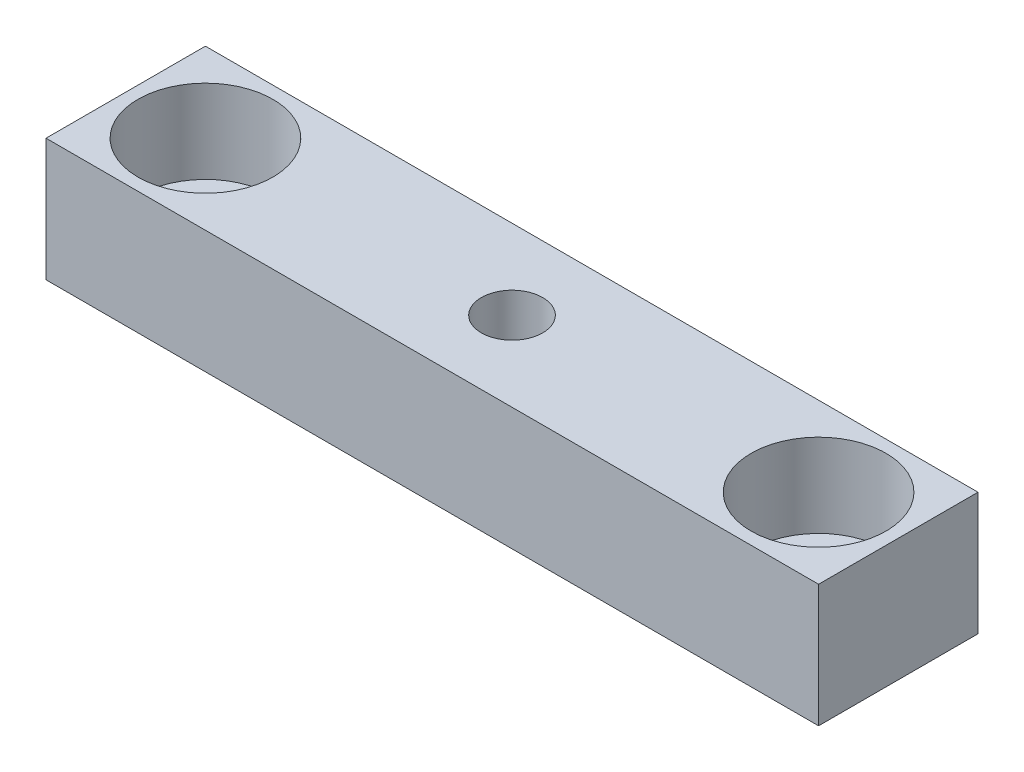
ISO-10303-21;
HEADER;
FILE_DESCRIPTION(('STEP AP214'),'2;1');
FILE_NAME('part.step','',(''),(''),'','','');
FILE_SCHEMA(('AUTOMOTIVE_DESIGN { 1 0 10303 214 1 1 1 1 }'));
ENDSEC;
DATA;
#1=APPLICATION_CONTEXT('core data for automotive mechanical design processes');
#2=APPLICATION_PROTOCOL_DEFINITION('international standard','automotive_design',2000,#1);
#3=PRODUCT_CONTEXT('',#1,'mechanical');
#4=PRODUCT('Part','Part','',(#3));
#5=PRODUCT_RELATED_PRODUCT_CATEGORY('part','',(#4));
#6=PRODUCT_DEFINITION_FORMATION('','',#4);
#7=PRODUCT_DEFINITION_CONTEXT('part definition',#1,'design');
#8=PRODUCT_DEFINITION('design','',#6,#7);
#9=PRODUCT_DEFINITION_SHAPE('','',#8);
#10=(LENGTH_UNIT() NAMED_UNIT(*) SI_UNIT(.MILLI.,.METRE.));
#11=(NAMED_UNIT(*) PLANE_ANGLE_UNIT() SI_UNIT($,.RADIAN.));
#12=(NAMED_UNIT(*) SI_UNIT($,.STERADIAN.) SOLID_ANGLE_UNIT());
#13=UNCERTAINTY_MEASURE_WITH_UNIT(LENGTH_MEASURE(1.E-05),#10,'distance_accuracy_value','');
#14=(GEOMETRIC_REPRESENTATION_CONTEXT(3) GLOBAL_UNCERTAINTY_ASSIGNED_CONTEXT((#13)) GLOBAL_UNIT_ASSIGNED_CONTEXT((#10,
#11,#12)) REPRESENTATION_CONTEXT('',''));
#15=CARTESIAN_POINT('',(0.,0.,0.));
#16=DIRECTION('',(0.,0.,1.));
#17=DIRECTION('',(1.,0.,0.));
#18=AXIS2_PLACEMENT_3D('',#15,#16,#17);
#19=CARTESIAN_POINT('',(31.5,10.,-6.5));
#20=DIRECTION('',(-1.,0.,0.));
#21=DIRECTION('',(0.,0.,1.));
#22=AXIS2_PLACEMENT_3D('',#19,#20,#21);
#23=PLANE('',#22);
#24=DIRECTION('',(0.,0.,-1.));
#25=VECTOR('',#24,1.);
#26=CARTESIAN_POINT('',(31.5,0.,-6.5));
#27=LINE('',#26,#25);
#28=CARTESIAN_POINT('',(31.5,0.,6.5));
#29=VERTEX_POINT('',#28);
#30=CARTESIAN_POINT('',(31.5,0.,-6.5));
#31=VERTEX_POINT('',#30);
#32=EDGE_CURVE('E185',#29,#31,#27,.T.);
#33=ORIENTED_EDGE('',*,*,#32,.T.);
#34=DIRECTION('',(0.,-1.,0.));
#35=VECTOR('',#34,1.);
#36=CARTESIAN_POINT('',(31.5,10.,-6.5));
#37=LINE('',#36,#35);
#38=CARTESIAN_POINT('',(31.5,10.,-6.5));
#39=VERTEX_POINT('',#38);
#40=EDGE_CURVE('E11',#39,#31,#37,.T.);
#41=ORIENTED_EDGE('',*,*,#40,.F.);
#42=DIRECTION('',(0.,0.,-1.));
#43=VECTOR('',#42,1.);
#44=CARTESIAN_POINT('',(31.5,10.,-6.5));
#45=LINE('',#44,#43);
#46=CARTESIAN_POINT('',(31.5,10.,6.5));
#47=VERTEX_POINT('',#46);
#48=EDGE_CURVE('E186',#47,#39,#45,.T.);
#49=ORIENTED_EDGE('',*,*,#48,.F.);
#50=DIRECTION('',(0.,-1.,0.));
#51=VECTOR('',#50,1.);
#52=CARTESIAN_POINT('',(31.5,10.,6.5));
#53=LINE('',#52,#51);
#54=EDGE_CURVE('E192',#47,#29,#53,.T.);
#55=ORIENTED_EDGE('',*,*,#54,.T.);
#56=EDGE_LOOP('',(#33,#41,#49,#55));
#57=FACE_BOUND('',#56,.T.);
#58=ADVANCED_FACE('F38',(#57),#23,.F.);
#59=CARTESIAN_POINT('',(-31.5,10.,-6.5));
#60=DIRECTION('',(0.,0.,1.));
#61=DIRECTION('',(1.,0.,0.));
#62=AXIS2_PLACEMENT_3D('',#59,#60,#61);
#63=PLANE('',#62);
#64=DIRECTION('',(-1.,0.,0.));
#65=VECTOR('',#64,1.);
#66=CARTESIAN_POINT('',(-31.5,0.,-6.5));
#67=LINE('',#66,#65);
#68=CARTESIAN_POINT('',(-31.5,0.,-6.5));
#69=VERTEX_POINT('',#68);
#70=EDGE_CURVE('E195',#31,#69,#67,.T.);
#71=ORIENTED_EDGE('',*,*,#70,.T.);
#72=DIRECTION('',(0.,-1.,0.));
#73=VECTOR('',#72,1.);
#74=CARTESIAN_POINT('',(-31.5,10.,-6.5));
#75=LINE('',#74,#73);
#76=CARTESIAN_POINT('',(-31.5,10.,-6.5));
#77=VERTEX_POINT('',#76);
#78=EDGE_CURVE('E45',#77,#69,#75,.T.);
#79=ORIENTED_EDGE('',*,*,#78,.F.);
#80=DIRECTION('',(-1.,0.,0.));
#81=VECTOR('',#80,1.);
#82=CARTESIAN_POINT('',(-31.5,10.,-6.5));
#83=LINE('',#82,#81);
#84=EDGE_CURVE('E89',#39,#77,#83,.T.);
#85=ORIENTED_EDGE('',*,*,#84,.F.);
#86=ORIENTED_EDGE('',*,*,#40,.T.);
#87=EDGE_LOOP('',(#71,#79,#85,#86));
#88=FACE_BOUND('',#87,.T.);
#89=ADVANCED_FACE('F224',(#88),#63,.F.);
#90=CARTESIAN_POINT('',(-31.5,10.,-6.5));
#91=DIRECTION('',(1.,0.,0.));
#92=DIRECTION('',(0.,0.,-1.));
#93=AXIS2_PLACEMENT_3D('',#90,#91,#92);
#94=PLANE('',#93);
#95=DIRECTION('',(0.,0.,1.));
#96=VECTOR('',#95,1.);
#97=CARTESIAN_POINT('',(-31.5,0.,-6.5));
#98=LINE('',#97,#96);
#99=CARTESIAN_POINT('',(-31.5,0.,6.5));
#100=VERTEX_POINT('',#99);
#101=EDGE_CURVE('E197',#69,#100,#98,.T.);
#102=ORIENTED_EDGE('',*,*,#101,.T.);
#103=DIRECTION('',(0.,-1.,0.));
#104=VECTOR('',#103,1.);
#105=CARTESIAN_POINT('',(-31.5,10.,6.5));
#106=LINE('',#105,#104);
#107=CARTESIAN_POINT('',(-31.5,10.,6.5));
#108=VERTEX_POINT('',#107);
#109=EDGE_CURVE('E201',#108,#100,#106,.T.);
#110=ORIENTED_EDGE('',*,*,#109,.F.);
#111=DIRECTION('',(0.,0.,1.));
#112=VECTOR('',#111,1.);
#113=CARTESIAN_POINT('',(-31.5,10.,-6.5));
#114=LINE('',#113,#112);
#115=EDGE_CURVE('E189',#77,#108,#114,.T.);
#116=ORIENTED_EDGE('',*,*,#115,.F.);
#117=ORIENTED_EDGE('',*,*,#78,.T.);
#118=EDGE_LOOP('',(#102,#110,#116,#117));
#119=FACE_BOUND('',#118,.T.);
#120=ADVANCED_FACE('F206',(#119),#94,.F.);
#121=CARTESIAN_POINT('',(-31.5,10.,6.5));
#122=DIRECTION('',(0.,0.,-1.));
#123=DIRECTION('',(-1.,0.,0.));
#124=AXIS2_PLACEMENT_3D('',#121,#122,#123);
#125=PLANE('',#124);
#126=DIRECTION('',(1.,0.,0.));
#127=VECTOR('',#126,1.);
#128=CARTESIAN_POINT('',(-31.5,0.,6.5));
#129=LINE('',#128,#127);
#130=EDGE_CURVE('E82',#100,#29,#129,.T.);
#131=ORIENTED_EDGE('',*,*,#130,.T.);
#132=ORIENTED_EDGE('',*,*,#54,.F.);
#133=DIRECTION('',(1.,0.,0.));
#134=VECTOR('',#133,1.);
#135=CARTESIAN_POINT('',(-31.5,10.,6.5));
#136=LINE('',#135,#134);
#137=EDGE_CURVE('E61',#108,#47,#136,.T.);
#138=ORIENTED_EDGE('',*,*,#137,.F.);
#139=ORIENTED_EDGE('',*,*,#109,.T.);
#140=EDGE_LOOP('',(#131,#132,#138,#139));
#141=FACE_BOUND('',#140,.T.);
#142=ADVANCED_FACE('F214',(#141),#125,.F.);
#143=CARTESIAN_POINT('',(0.,10.,0.));
#144=DIRECTION('',(0.,1.,0.));
#145=DIRECTION('',(0.,0.,1.));
#146=AXIS2_PLACEMENT_3D('',#143,#144,#145);
#147=PLANE('',#146);
#148=CARTESIAN_POINT('',(0.,10.,0.));
#149=DIRECTION('',(0.,-1.,0.));
#150=DIRECTION('',(0.,0.,-1.));
#151=AXIS2_PLACEMENT_3D('',#148,#149,#150);
#152=CIRCLE('',#151,2.5);
#153=CARTESIAN_POINT('',(0.,10.,-2.5));
#154=VERTEX_POINT('',#153);
#155=EDGE_CURVE('E140',#154,#154,#152,.T.);
#156=ORIENTED_EDGE('',*,*,#155,.T.);
#157=EDGE_LOOP('',(#156));
#158=FACE_BOUND('',#157,.T.);
#159=CARTESIAN_POINT('',(-25.,10.,0.));
#160=DIRECTION('',(0.,1.,0.));
#161=DIRECTION('',(0.,0.,1.));
#162=AXIS2_PLACEMENT_3D('',#159,#160,#161);
#163=CIRCLE('',#162,5.49999999999999);
#164=CARTESIAN_POINT('',(-25.,10.,5.49999999999999));
#165=VERTEX_POINT('',#164);
#166=EDGE_CURVE('E161',#165,#165,#163,.T.);
#167=ORIENTED_EDGE('',*,*,#166,.F.);
#168=EDGE_LOOP('',(#167));
#169=FACE_BOUND('',#168,.T.);
#170=CARTESIAN_POINT('',(25.,10.,0.));
#171=DIRECTION('',(0.,1.,0.));
#172=DIRECTION('',(0.,0.,1.));
#173=AXIS2_PLACEMENT_3D('',#170,#171,#172);
#174=CIRCLE('',#173,5.49999999999999);
#175=CARTESIAN_POINT('',(25.,10.,5.49999999999998));
#176=VERTEX_POINT('',#175);
#177=EDGE_CURVE('E173',#176,#176,#174,.T.);
#178=ORIENTED_EDGE('',*,*,#177,.F.);
#179=EDGE_LOOP('',(#178));
#180=FACE_BOUND('',#179,.T.);
#181=ORIENTED_EDGE('',*,*,#48,.T.);
#182=ORIENTED_EDGE('',*,*,#84,.T.);
#183=ORIENTED_EDGE('',*,*,#115,.T.);
#184=ORIENTED_EDGE('',*,*,#137,.T.);
#185=EDGE_LOOP('',(#181,#182,#183,#184));
#186=FACE_BOUND('',#185,.T.);
#187=ADVANCED_FACE('F216',(#158,#169,#180,#186),#147,.T.);
#188=CARTESIAN_POINT('',(0.,0.,0.));
#189=DIRECTION('',(0.,1.,0.));
#190=DIRECTION('',(0.,0.,1.));
#191=AXIS2_PLACEMENT_3D('',#188,#189,#190);
#192=PLANE('',#191);
#193=CARTESIAN_POINT('',(0.,0.,0.));
#194=DIRECTION('',(0.,-1.,0.));
#195=DIRECTION('',(0.,0.,-1.));
#196=AXIS2_PLACEMENT_3D('',#193,#194,#195);
#197=CIRCLE('',#196,2.49999999999999);
#198=CARTESIAN_POINT('',(0.,0.,-2.49999999999999));
#199=VERTEX_POINT('',#198);
#200=EDGE_CURVE('E405',#199,#199,#197,.T.);
#201=ORIENTED_EDGE('',*,*,#200,.F.);
#202=EDGE_LOOP('',(#201));
#203=FACE_BOUND('',#202,.T.);
#204=DIRECTION('',(1.,0.,0.));
#205=VECTOR('',#204,1.);
#206=CARTESIAN_POINT('',(14.5,0.,-2.));
#207=LINE('',#206,#205);
#208=CARTESIAN_POINT('',(14.5,0.,-2.));
#209=VERTEX_POINT('',#208);
#210=CARTESIAN_POINT('',(15.5,0.,-2.));
#211=VERTEX_POINT('',#210);
#212=EDGE_CURVE('E146',#209,#211,#207,.T.);
#213=ORIENTED_EDGE('',*,*,#212,.F.);
#214=CARTESIAN_POINT('',(14.5,0.,0.));
#215=DIRECTION('',(0.,-1.,0.));
#216=DIRECTION('',(0.,0.,-1.));
#217=AXIS2_PLACEMENT_3D('',#214,#215,#216);
#218=CIRCLE('',#217,2.);
#219=CARTESIAN_POINT('',(14.5,0.,2.));
#220=VERTEX_POINT('',#219);
#221=EDGE_CURVE('E52',#220,#209,#218,.T.);
#222=ORIENTED_EDGE('',*,*,#221,.F.);
#223=DIRECTION('',(-1.,0.,0.));
#224=VECTOR('',#223,1.);
#225=CARTESIAN_POINT('',(14.5,0.,2.));
#226=LINE('',#225,#224);
#227=CARTESIAN_POINT('',(15.5,0.,2.));
#228=VERTEX_POINT('',#227);
#229=EDGE_CURVE('E134',#228,#220,#226,.T.);
#230=ORIENTED_EDGE('',*,*,#229,.F.);
#231=CARTESIAN_POINT('',(15.5,0.,0.));
#232=DIRECTION('',(0.,-1.,0.));
#233=DIRECTION('',(0.,0.,-1.));
#234=AXIS2_PLACEMENT_3D('',#231,#232,#233);
#235=CIRCLE('',#234,2.);
#236=EDGE_CURVE('E137',#211,#228,#235,.T.);
#237=ORIENTED_EDGE('',*,*,#236,.F.);
#238=EDGE_LOOP('',(#213,#222,#230,#237));
#239=FACE_BOUND('',#238,.T.);
#240=CARTESIAN_POINT('',(-15.,0.,0.));
#241=DIRECTION('',(0.,-1.,0.));
#242=DIRECTION('',(0.,0.,-1.));
#243=AXIS2_PLACEMENT_3D('',#240,#241,#242);
#244=CIRCLE('',#243,1.99999999999999);
#245=CARTESIAN_POINT('',(-15.,0.,-1.99999999999999));
#246=VERTEX_POINT('',#245);
#247=EDGE_CURVE('E152',#246,#246,#244,.T.);
#248=ORIENTED_EDGE('',*,*,#247,.F.);
#249=EDGE_LOOP('',(#248));
#250=FACE_BOUND('',#249,.T.);
#251=CARTESIAN_POINT('',(-25.,0.,0.));
#252=DIRECTION('',(0.,1.,0.));
#253=DIRECTION('',(0.,0.,1.));
#254=AXIS2_PLACEMENT_3D('',#251,#252,#253);
#255=CIRCLE('',#254,3.3);
#256=CARTESIAN_POINT('',(-25.,0.,3.3));
#257=VERTEX_POINT('',#256);
#258=EDGE_CURVE('E170',#257,#257,#255,.T.);
#259=ORIENTED_EDGE('',*,*,#258,.T.);
#260=EDGE_LOOP('',(#259));
#261=FACE_BOUND('',#260,.T.);
#262=CARTESIAN_POINT('',(25.,0.,0.));
#263=DIRECTION('',(0.,1.,0.));
#264=DIRECTION('',(0.,0.,1.));
#265=AXIS2_PLACEMENT_3D('',#262,#263,#264);
#266=CIRCLE('',#265,3.3);
#267=CARTESIAN_POINT('',(25.,0.,3.29999999999999));
#268=VERTEX_POINT('',#267);
#269=EDGE_CURVE('E182',#268,#268,#266,.T.);
#270=ORIENTED_EDGE('',*,*,#269,.T.);
#271=EDGE_LOOP('',(#270));
#272=FACE_BOUND('',#271,.T.);
#273=ORIENTED_EDGE('',*,*,#32,.F.);
#274=ORIENTED_EDGE('',*,*,#130,.F.);
#275=ORIENTED_EDGE('',*,*,#101,.F.);
#276=ORIENTED_EDGE('',*,*,#70,.F.);
#277=EDGE_LOOP('',(#273,#274,#275,#276));
#278=FACE_BOUND('',#277,.T.);
#279=ADVANCED_FACE('F210',(#203,#239,#250,#261,#272,#278),#192,.F.);
#280=CARTESIAN_POINT('',(25.,10.,0.));
#281=DIRECTION('',(0.,1.,0.));
#282=DIRECTION('',(0.,0.,1.));
#283=AXIS2_PLACEMENT_3D('',#280,#281,#282);
#284=CYLINDRICAL_SURFACE('',#283,3.3);
#285=ORIENTED_EDGE('',*,*,#269,.F.);
#286=EDGE_LOOP('',(#285));
#287=FACE_BOUND('',#286,.T.);
#288=CARTESIAN_POINT('',(25.,3.2,0.));
#289=DIRECTION('',(0.,1.,0.));
#290=DIRECTION('',(0.,0.,1.));
#291=AXIS2_PLACEMENT_3D('',#288,#289,#290);
#292=CIRCLE('',#291,3.3);
#293=CARTESIAN_POINT('',(25.,3.2,3.29999999999999));
#294=VERTEX_POINT('',#293);
#295=EDGE_CURVE('E179',#294,#294,#292,.T.);
#296=ORIENTED_EDGE('',*,*,#295,.T.);
#297=EDGE_LOOP('',(#296));
#298=FACE_BOUND('',#297,.T.);
#299=ADVANCED_FACE('F247',(#287,#298),#284,.F.);
#300=CARTESIAN_POINT('',(28.3,3.2,0.));
#301=DIRECTION('',(0.,-1.,0.));
#302=DIRECTION('',(0.,0.,-1.));
#303=AXIS2_PLACEMENT_3D('',#300,#301,#302);
#304=PLANE('',#303);
#305=ORIENTED_EDGE('',*,*,#295,.F.);
#306=EDGE_LOOP('',(#305));
#307=FACE_BOUND('',#306,.T.);
#308=CARTESIAN_POINT('',(25.,3.2,0.));
#309=DIRECTION('',(0.,1.,0.));
#310=DIRECTION('',(0.,0.,1.));
#311=AXIS2_PLACEMENT_3D('',#308,#309,#310);
#312=CIRCLE('',#311,5.5);
#313=CARTESIAN_POINT('',(25.,3.2,5.49999999999999));
#314=VERTEX_POINT('',#313);
#315=EDGE_CURVE('E176',#314,#314,#312,.T.);
#316=ORIENTED_EDGE('',*,*,#315,.T.);
#317=EDGE_LOOP('',(#316));
#318=FACE_BOUND('',#317,.T.);
#319=ADVANCED_FACE('F252',(#307,#318),#304,.F.);
#320=CARTESIAN_POINT('',(25.,10.,0.));
#321=DIRECTION('',(0.,1.,0.));
#322=DIRECTION('',(0.,0.,1.));
#323=AXIS2_PLACEMENT_3D('',#320,#321,#322);
#324=CYLINDRICAL_SURFACE('',#323,5.5);
#325=ORIENTED_EDGE('',*,*,#315,.F.);
#326=EDGE_LOOP('',(#325));
#327=FACE_BOUND('',#326,.T.);
#328=ORIENTED_EDGE('',*,*,#177,.T.);
#329=EDGE_LOOP('',(#328));
#330=FACE_BOUND('',#329,.T.);
#331=ADVANCED_FACE('F264',(#327,#330),#324,.F.);
#332=CARTESIAN_POINT('',(-25.,10.,0.));
#333=DIRECTION('',(0.,1.,0.));
#334=DIRECTION('',(0.,0.,1.));
#335=AXIS2_PLACEMENT_3D('',#332,#333,#334);
#336=CYLINDRICAL_SURFACE('',#335,3.3);
#337=ORIENTED_EDGE('',*,*,#258,.F.);
#338=EDGE_LOOP('',(#337));
#339=FACE_BOUND('',#338,.T.);
#340=CARTESIAN_POINT('',(-25.,3.2,0.));
#341=DIRECTION('',(0.,1.,0.));
#342=DIRECTION('',(0.,0.,1.));
#343=AXIS2_PLACEMENT_3D('',#340,#341,#342);
#344=CIRCLE('',#343,3.3);
#345=CARTESIAN_POINT('',(-25.,3.2,3.3));
#346=VERTEX_POINT('',#345);
#347=EDGE_CURVE('E167',#346,#346,#344,.T.);
#348=ORIENTED_EDGE('',*,*,#347,.T.);
#349=EDGE_LOOP('',(#348));
#350=FACE_BOUND('',#349,.T.);
#351=ADVANCED_FACE('F274',(#339,#350),#336,.F.);
#352=CARTESIAN_POINT('',(-21.7,3.2,0.));
#353=DIRECTION('',(0.,-1.,0.));
#354=DIRECTION('',(0.,0.,-1.));
#355=AXIS2_PLACEMENT_3D('',#352,#353,#354);
#356=PLANE('',#355);
#357=ORIENTED_EDGE('',*,*,#347,.F.);
#358=EDGE_LOOP('',(#357));
#359=FACE_BOUND('',#358,.T.);
#360=CARTESIAN_POINT('',(-25.,3.2,0.));
#361=DIRECTION('',(0.,1.,0.));
#362=DIRECTION('',(0.,0.,1.));
#363=AXIS2_PLACEMENT_3D('',#360,#361,#362);
#364=CIRCLE('',#363,5.5);
#365=CARTESIAN_POINT('',(-25.,3.2,5.5));
#366=VERTEX_POINT('',#365);
#367=EDGE_CURVE('E164',#366,#366,#364,.T.);
#368=ORIENTED_EDGE('',*,*,#367,.T.);
#369=EDGE_LOOP('',(#368));
#370=FACE_BOUND('',#369,.T.);
#371=ADVANCED_FACE('F284',(#359,#370),#356,.F.);
#372=CARTESIAN_POINT('',(-25.,10.,0.));
#373=DIRECTION('',(0.,1.,0.));
#374=DIRECTION('',(0.,0.,1.));
#375=AXIS2_PLACEMENT_3D('',#372,#373,#374);
#376=CYLINDRICAL_SURFACE('',#375,5.5);
#377=ORIENTED_EDGE('',*,*,#367,.F.);
#378=EDGE_LOOP('',(#377));
#379=FACE_BOUND('',#378,.T.);
#380=ORIENTED_EDGE('',*,*,#166,.T.);
#381=EDGE_LOOP('',(#380));
#382=FACE_BOUND('',#381,.T.);
#383=ADVANCED_FACE('F294',(#379,#382),#376,.F.);
#384=CARTESIAN_POINT('',(-15.,5.,0.));
#385=DIRECTION('',(0.,-1.,0.));
#386=DIRECTION('',(0.,0.,-1.));
#387=AXIS2_PLACEMENT_3D('',#384,#385,#386);
#388=CONICAL_SURFACE('',#387,2.,1.02974425867665);
#389=CARTESIAN_POINT('',(-15.,6.20172123805512,0.));
#390=VERTEX_POINT('',#389);
#391=VERTEX_LOOP('',#390);
#392=FACE_BOUND('',#391,.T.);
#393=CARTESIAN_POINT('',(-15.,5.,0.));
#394=DIRECTION('',(0.,-1.,0.));
#395=DIRECTION('',(0.,0.,-1.));
#396=AXIS2_PLACEMENT_3D('',#393,#394,#395);
#397=CIRCLE('',#396,2.);
#398=CARTESIAN_POINT('',(-15.,5.,-2.));
#399=VERTEX_POINT('',#398);
#400=EDGE_CURVE('E158',#399,#399,#397,.T.);
#401=ORIENTED_EDGE('',*,*,#400,.T.);
#402=EDGE_LOOP('',(#401));
#403=FACE_BOUND('',#402,.T.);
#404=ADVANCED_FACE('F304',(#392,#403),#388,.F.);
#405=CARTESIAN_POINT('',(-15.,0.,0.));
#406=DIRECTION('',(0.,-1.,0.));
#407=DIRECTION('',(0.,0.,-1.));
#408=AXIS2_PLACEMENT_3D('',#405,#406,#407);
#409=CYLINDRICAL_SURFACE('',#408,1.99999999999999);
#410=ORIENTED_EDGE('',*,*,#400,.F.);
#411=EDGE_LOOP('',(#410));
#412=FACE_BOUND('',#411,.T.);
#413=ORIENTED_EDGE('',*,*,#247,.T.);
#414=EDGE_LOOP('',(#413));
#415=FACE_BOUND('',#414,.T.);
#416=ADVANCED_FACE('F314',(#412,#415),#409,.F.);
#417=CARTESIAN_POINT('',(14.5,5.,0.));
#418=DIRECTION('',(0.,-1.,0.));
#419=DIRECTION('',(0.,0.,-1.));
#420=AXIS2_PLACEMENT_3D('',#417,#418,#419);
#421=CYLINDRICAL_SURFACE('',#420,2.);
#422=ORIENTED_EDGE('',*,*,#221,.T.);
#423=DIRECTION('',(0.,-1.,0.));
#424=VECTOR('',#423,1.);
#425=CARTESIAN_POINT('',(14.5,5.,-2.));
#426=LINE('',#425,#424);
#427=CARTESIAN_POINT('',(14.5,5.,-2.));
#428=VERTEX_POINT('',#427);
#429=EDGE_CURVE('E112',#428,#209,#426,.T.);
#430=ORIENTED_EDGE('',*,*,#429,.F.);
#431=CARTESIAN_POINT('',(14.5,5.,0.));
#432=DIRECTION('',(0.,-1.,0.));
#433=DIRECTION('',(0.,0.,-1.));
#434=AXIS2_PLACEMENT_3D('',#431,#432,#433);
#435=CIRCLE('',#434,2.);
#436=CARTESIAN_POINT('',(14.5,5.,2.));
#437=VERTEX_POINT('',#436);
#438=EDGE_CURVE('E116',#437,#428,#435,.T.);
#439=ORIENTED_EDGE('',*,*,#438,.F.);
#440=DIRECTION('',(0.,-1.,0.));
#441=VECTOR('',#440,1.);
#442=CARTESIAN_POINT('',(14.5,5.,2.));
#443=LINE('',#442,#441);
#444=EDGE_CURVE('E150',#437,#220,#443,.T.);
#445=ORIENTED_EDGE('',*,*,#444,.T.);
#446=EDGE_LOOP('',(#422,#430,#439,#445));
#447=FACE_BOUND('',#446,.T.);
#448=ADVANCED_FACE('F114',(#447),#421,.F.);
#449=CARTESIAN_POINT('',(14.5,5.,2.));
#450=DIRECTION('',(0.,0.,1.));
#451=DIRECTION('',(1.,0.,0.));
#452=AXIS2_PLACEMENT_3D('',#449,#450,#451);
#453=PLANE('',#452);
#454=ORIENTED_EDGE('',*,*,#229,.T.);
#455=ORIENTED_EDGE('',*,*,#444,.F.);
#456=DIRECTION('',(-1.,0.,0.));
#457=VECTOR('',#456,1.);
#458=CARTESIAN_POINT('',(14.5,5.,2.));
#459=LINE('',#458,#457);
#460=CARTESIAN_POINT('',(15.5,5.,2.));
#461=VERTEX_POINT('',#460);
#462=EDGE_CURVE('E122',#461,#437,#459,.T.);
#463=ORIENTED_EDGE('',*,*,#462,.F.);
#464=DIRECTION('',(0.,-1.,0.));
#465=VECTOR('',#464,1.);
#466=CARTESIAN_POINT('',(15.5,5.,2.));
#467=LINE('',#466,#465);
#468=EDGE_CURVE('E153',#461,#228,#467,.T.);
#469=ORIENTED_EDGE('',*,*,#468,.T.);
#470=EDGE_LOOP('',(#454,#455,#463,#469));
#471=FACE_BOUND('',#470,.T.);
#472=ADVANCED_FACE('F333',(#471),#453,.F.);
#473=CARTESIAN_POINT('',(15.5,5.,0.));
#474=DIRECTION('',(0.,-1.,0.));
#475=DIRECTION('',(0.,0.,-1.));
#476=AXIS2_PLACEMENT_3D('',#473,#474,#475);
#477=CYLINDRICAL_SURFACE('',#476,2.);
#478=ORIENTED_EDGE('',*,*,#236,.T.);
#479=ORIENTED_EDGE('',*,*,#468,.F.);
#480=CARTESIAN_POINT('',(15.5,5.,0.));
#481=DIRECTION('',(0.,-1.,0.));
#482=DIRECTION('',(0.,0.,-1.));
#483=AXIS2_PLACEMENT_3D('',#480,#481,#482);
#484=CIRCLE('',#483,2.);
#485=CARTESIAN_POINT('',(15.5,5.,-2.));
#486=VERTEX_POINT('',#485);
#487=EDGE_CURVE('E130',#486,#461,#484,.T.);
#488=ORIENTED_EDGE('',*,*,#487,.F.);
#489=DIRECTION('',(0.,-1.,0.));
#490=VECTOR('',#489,1.);
#491=CARTESIAN_POINT('',(15.5,5.,-2.));
#492=LINE('',#491,#490);
#493=EDGE_CURVE('E121',#486,#211,#492,.T.);
#494=ORIENTED_EDGE('',*,*,#493,.T.);
#495=EDGE_LOOP('',(#478,#479,#488,#494));
#496=FACE_BOUND('',#495,.T.);
#497=ADVANCED_FACE('F342',(#496),#477,.F.);
#498=CARTESIAN_POINT('',(14.5,5.,-2.));
#499=DIRECTION('',(0.,0.,-1.));
#500=DIRECTION('',(-1.,0.,0.));
#501=AXIS2_PLACEMENT_3D('',#498,#499,#500);
#502=PLANE('',#501);
#503=ORIENTED_EDGE('',*,*,#212,.T.);
#504=ORIENTED_EDGE('',*,*,#493,.F.);
#505=DIRECTION('',(1.,0.,0.));
#506=VECTOR('',#505,1.);
#507=CARTESIAN_POINT('',(14.5,5.,-2.));
#508=LINE('',#507,#506);
#509=EDGE_CURVE('E125',#428,#486,#508,.T.);
#510=ORIENTED_EDGE('',*,*,#509,.F.);
#511=ORIENTED_EDGE('',*,*,#429,.T.);
#512=EDGE_LOOP('',(#503,#504,#510,#511));
#513=FACE_BOUND('',#512,.T.);
#514=ADVANCED_FACE('F126',(#513),#502,.F.);
#515=CARTESIAN_POINT('',(14.5,5.,0.));
#516=DIRECTION('',(0.,-1.,0.));
#517=DIRECTION('',(0.,0.,-1.));
#518=AXIS2_PLACEMENT_3D('',#515,#516,#517);
#519=PLANE('',#518);
#520=ORIENTED_EDGE('',*,*,#438,.T.);
#521=ORIENTED_EDGE('',*,*,#509,.T.);
#522=ORIENTED_EDGE('',*,*,#487,.T.);
#523=ORIENTED_EDGE('',*,*,#462,.T.);
#524=EDGE_LOOP('',(#520,#521,#522,#523));
#525=FACE_BOUND('',#524,.T.);
#526=ADVANCED_FACE('F132',(#525),#519,.T.);
#527=CARTESIAN_POINT('',(0.,0.,0.));
#528=DIRECTION('',(0.,-1.,0.));
#529=DIRECTION('',(0.,0.,-1.));
#530=AXIS2_PLACEMENT_3D('',#527,#528,#529);
#531=CYLINDRICAL_SURFACE('',#530,2.49999999999999);
#532=ORIENTED_EDGE('',*,*,#155,.F.);
#533=EDGE_LOOP('',(#532));
#534=FACE_BOUND('',#533,.T.);
#535=ORIENTED_EDGE('',*,*,#200,.T.);
#536=EDGE_LOOP('',(#535));
#537=FACE_BOUND('',#536,.T.);
#538=ADVANCED_FACE('F369',(#534,#537),#531,.F.);
#539=CLOSED_SHELL('',(#58,#89,#120,#142,#187,#279,#299,#319,#331,#351,#371,#383,#404,#416,#448,
#472,#497,#514,#526,#538));
#540=MANIFOLD_SOLID_BREP('B2',#539);
#541=ADVANCED_BREP_SHAPE_REPRESENTATION('',(#18,#540),#14);
#542=SHAPE_DEFINITION_REPRESENTATION(#9,#541);
ENDSEC;
END-ISO-10303-21;
